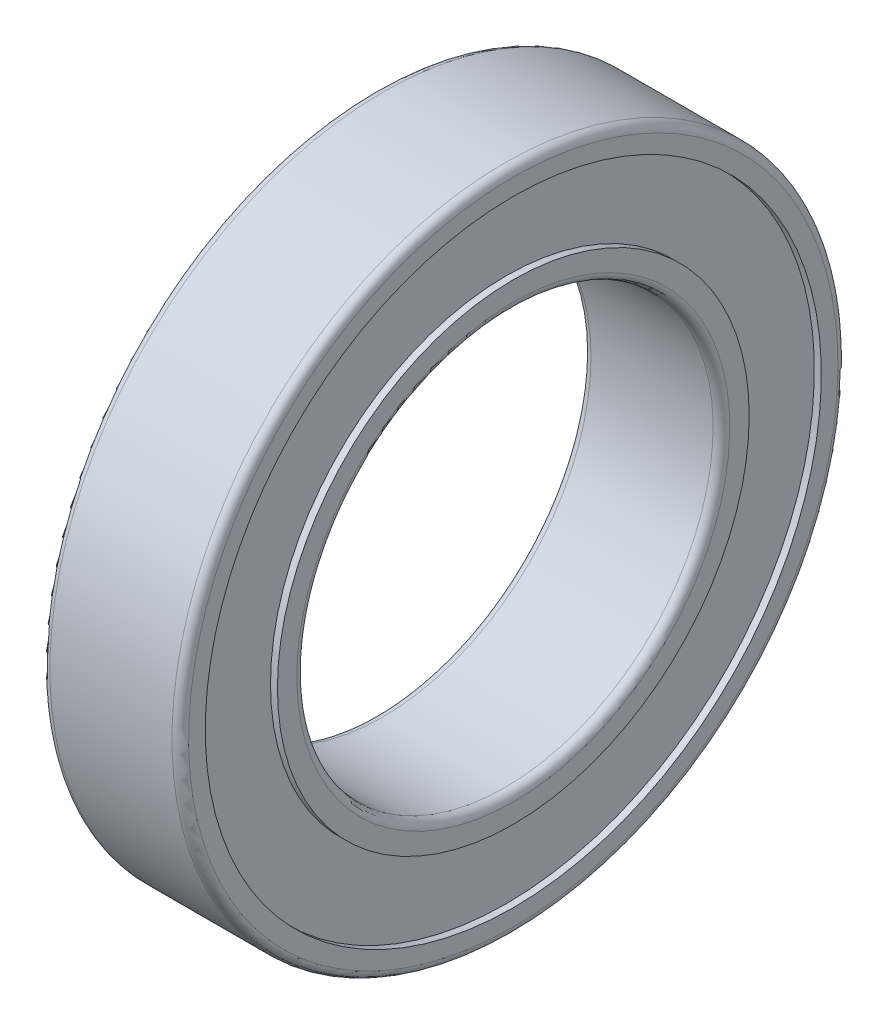
ISO-10303-21;
HEADER;
FILE_DESCRIPTION(('STEP AP214'),'2;1');
FILE_NAME('part.step','',(''),(''),'','','');
FILE_SCHEMA(('AUTOMOTIVE_DESIGN { 1 0 10303 214 1 1 1 1 }'));
ENDSEC;
DATA;
#1=APPLICATION_CONTEXT('core data for automotive mechanical design processes');
#2=APPLICATION_PROTOCOL_DEFINITION('international standard','automotive_design',2000,#1);
#3=PRODUCT_CONTEXT('',#1,'mechanical');
#4=PRODUCT('Part','Part','',(#3));
#5=PRODUCT_RELATED_PRODUCT_CATEGORY('part','',(#4));
#6=PRODUCT_DEFINITION_FORMATION('','',#4);
#7=PRODUCT_DEFINITION_CONTEXT('part definition',#1,'design');
#8=PRODUCT_DEFINITION('design','',#6,#7);
#9=PRODUCT_DEFINITION_SHAPE('','',#8);
#10=(LENGTH_UNIT() NAMED_UNIT(*) SI_UNIT(.MILLI.,.METRE.));
#11=(NAMED_UNIT(*) PLANE_ANGLE_UNIT() SI_UNIT($,.RADIAN.));
#12=(NAMED_UNIT(*) SI_UNIT($,.STERADIAN.) SOLID_ANGLE_UNIT());
#13=UNCERTAINTY_MEASURE_WITH_UNIT(LENGTH_MEASURE(1.E-05),#10,'distance_accuracy_value','');
#14=(GEOMETRIC_REPRESENTATION_CONTEXT(3) GLOBAL_UNCERTAINTY_ASSIGNED_CONTEXT((#13)) GLOBAL_UNIT_ASSIGNED_CONTEXT((#10,
#11,#12)) REPRESENTATION_CONTEXT('',''));
#15=CARTESIAN_POINT('',(0.,0.,0.));
#16=DIRECTION('',(0.,0.,1.));
#17=DIRECTION('',(1.,0.,0.));
#18=AXIS2_PLACEMENT_3D('',#15,#16,#17);
#19=CARTESIAN_POINT('',(0.,0.,0.));
#20=DIRECTION('',(-1.,0.,0.));
#21=DIRECTION('',(0.,-1.,0.));
#22=AXIS2_PLACEMENT_3D('',#19,#20,#21);
#23=CYLINDRICAL_SURFACE('',#22,7.5);
#24=CARTESIAN_POINT('',(0.3,0.,0.));
#25=DIRECTION('',(1.,0.,0.));
#26=DIRECTION('',(0.,1.,0.));
#27=AXIS2_PLACEMENT_3D('',#24,#25,#26);
#28=CIRCLE('',#27,7.5);
#29=CARTESIAN_POINT('',(0.3,7.5,0.));
#30=VERTEX_POINT('',#29);
#31=EDGE_CURVE('E57',#30,#30,#28,.F.);
#32=ORIENTED_EDGE('',*,*,#31,.T.);
#33=EDGE_LOOP('',(#32));
#34=FACE_BOUND('',#33,.T.);
#35=CARTESIAN_POINT('',(4.7,0.,0.));
#36=DIRECTION('',(-1.,0.,0.));
#37=DIRECTION('',(0.,-1.,0.));
#38=AXIS2_PLACEMENT_3D('',#35,#36,#37);
#39=CIRCLE('',#38,7.5);
#40=CARTESIAN_POINT('',(4.7,-7.5,0.));
#41=VERTEX_POINT('',#40);
#42=EDGE_CURVE('E60',#41,#41,#39,.F.);
#43=ORIENTED_EDGE('',*,*,#42,.T.);
#44=EDGE_LOOP('',(#43));
#45=FACE_BOUND('',#44,.T.);
#46=ADVANCED_FACE('F31',(#34,#45),#23,.F.);
#47=CARTESIAN_POINT('',(0.,7.5,0.));
#48=DIRECTION('',(1.,0.,0.));
#49=DIRECTION('',(0.,1.,0.));
#50=AXIS2_PLACEMENT_3D('',#47,#48,#49);
#51=PLANE('',#50);
#52=CARTESIAN_POINT('',(0.,0.,0.));
#53=DIRECTION('',(1.,0.,0.));
#54=DIRECTION('',(0.,1.,0.));
#55=AXIS2_PLACEMENT_3D('',#52,#53,#54);
#56=CIRCLE('',#55,7.8);
#57=CARTESIAN_POINT('',(0.,7.8,0.));
#58=VERTEX_POINT('',#57);
#59=EDGE_CURVE('E54',#58,#58,#56,.T.);
#60=ORIENTED_EDGE('',*,*,#59,.T.);
#61=EDGE_LOOP('',(#60));
#62=FACE_BOUND('',#61,.T.);
#63=CARTESIAN_POINT('',(0.,0.,0.));
#64=DIRECTION('',(-1.,0.,0.));
#65=DIRECTION('',(0.,-1.,0.));
#66=AXIS2_PLACEMENT_3D('',#63,#64,#65);
#67=CIRCLE('',#66,8.5);
#68=CARTESIAN_POINT('',(0.,-8.5,0.));
#69=VERTEX_POINT('',#68);
#70=EDGE_CURVE('E63',#69,#69,#67,.T.);
#71=ORIENTED_EDGE('',*,*,#70,.T.);
#72=EDGE_LOOP('',(#71));
#73=FACE_BOUND('',#72,.T.);
#74=ADVANCED_FACE('F106',(#62,#73),#51,.F.);
#75=CARTESIAN_POINT('',(0.,0.,0.));
#76=DIRECTION('',(-1.,0.,0.));
#77=DIRECTION('',(0.,-1.,0.));
#78=AXIS2_PLACEMENT_3D('',#75,#76,#77);
#79=CYLINDRICAL_SURFACE('',#78,8.5);
#80=ORIENTED_EDGE('',*,*,#70,.F.);
#81=EDGE_LOOP('',(#80));
#82=FACE_BOUND('',#81,.T.);
#83=CARTESIAN_POINT('',(0.25,0.,0.));
#84=DIRECTION('',(-1.,0.,0.));
#85=DIRECTION('',(0.,-1.,0.));
#86=AXIS2_PLACEMENT_3D('',#83,#84,#85);
#87=CIRCLE('',#86,8.5);
#88=CARTESIAN_POINT('',(0.25,-8.5,0.));
#89=VERTEX_POINT('',#88);
#90=EDGE_CURVE('E66',#89,#89,#87,.T.);
#91=ORIENTED_EDGE('',*,*,#90,.T.);
#92=EDGE_LOOP('',(#91));
#93=FACE_BOUND('',#92,.T.);
#94=ADVANCED_FACE('F112',(#82,#93),#79,.T.);
#95=CARTESIAN_POINT('',(0.25,8.5,0.));
#96=DIRECTION('',(1.,0.,0.));
#97=DIRECTION('',(0.,1.,0.));
#98=AXIS2_PLACEMENT_3D('',#95,#96,#97);
#99=PLANE('',#98);
#100=ORIENTED_EDGE('',*,*,#90,.F.);
#101=EDGE_LOOP('',(#100));
#102=FACE_BOUND('',#101,.T.);
#103=CARTESIAN_POINT('',(0.25,0.,0.));
#104=DIRECTION('',(-1.,0.,0.));
#105=DIRECTION('',(0.,-1.,0.));
#106=AXIS2_PLACEMENT_3D('',#103,#104,#105);
#107=CIRCLE('',#106,11.1);
#108=CARTESIAN_POINT('',(0.249999999999999,-11.1,0.));
#109=VERTEX_POINT('',#108);
#110=EDGE_CURVE('E69',#109,#109,#107,.T.);
#111=ORIENTED_EDGE('',*,*,#110,.T.);
#112=EDGE_LOOP('',(#111));
#113=FACE_BOUND('',#112,.T.);
#114=ADVANCED_FACE('F139',(#102,#113),#99,.F.);
#115=CARTESIAN_POINT('',(0.,0.,0.));
#116=DIRECTION('',(-1.,0.,0.));
#117=DIRECTION('',(0.,-1.,0.));
#118=AXIS2_PLACEMENT_3D('',#115,#116,#117);
#119=CYLINDRICAL_SURFACE('',#118,11.1);
#120=ORIENTED_EDGE('',*,*,#110,.F.);
#121=EDGE_LOOP('',(#120));
#122=FACE_BOUND('',#121,.T.);
#123=CARTESIAN_POINT('',(0.,0.,0.));
#124=DIRECTION('',(-1.,0.,0.));
#125=DIRECTION('',(0.,-1.,0.));
#126=AXIS2_PLACEMENT_3D('',#123,#124,#125);
#127=CIRCLE('',#126,11.1);
#128=CARTESIAN_POINT('',(0.,-11.1,0.));
#129=VERTEX_POINT('',#128);
#130=EDGE_CURVE('E72',#129,#129,#127,.T.);
#131=ORIENTED_EDGE('',*,*,#130,.T.);
#132=EDGE_LOOP('',(#131));
#133=FACE_BOUND('',#132,.T.);
#134=ADVANCED_FACE('F134',(#122,#133),#119,.F.);
#135=CARTESIAN_POINT('',(0.,11.1,0.));
#136=DIRECTION('',(1.,0.,0.));
#137=DIRECTION('',(0.,1.,0.));
#138=AXIS2_PLACEMENT_3D('',#135,#136,#137);
#139=PLANE('',#138);
#140=CARTESIAN_POINT('',(0.,0.,0.));
#141=DIRECTION('',(1.,0.,0.));
#142=DIRECTION('',(0.,1.,0.));
#143=AXIS2_PLACEMENT_3D('',#140,#141,#142);
#144=CIRCLE('',#143,11.7);
#145=CARTESIAN_POINT('',(0.,11.7,0.));
#146=VERTEX_POINT('',#145);
#147=EDGE_CURVE('E46',#146,#146,#144,.F.);
#148=ORIENTED_EDGE('',*,*,#147,.T.);
#149=EDGE_LOOP('',(#148));
#150=FACE_BOUND('',#149,.T.);
#151=ORIENTED_EDGE('',*,*,#130,.F.);
#152=EDGE_LOOP('',(#151));
#153=FACE_BOUND('',#152,.T.);
#154=ADVANCED_FACE('F130',(#150,#153),#139,.F.);
#155=CARTESIAN_POINT('',(0.,0.,0.));
#156=DIRECTION('',(-1.,0.,0.));
#157=DIRECTION('',(0.,-1.,0.));
#158=AXIS2_PLACEMENT_3D('',#155,#156,#157);
#159=CYLINDRICAL_SURFACE('',#158,12.);
#160=CARTESIAN_POINT('',(0.3,0.,0.));
#161=DIRECTION('',(1.,0.,0.));
#162=DIRECTION('',(0.,1.,0.));
#163=AXIS2_PLACEMENT_3D('',#160,#161,#162);
#164=CIRCLE('',#163,12.);
#165=CARTESIAN_POINT('',(0.3,12.,0.));
#166=VERTEX_POINT('',#165);
#167=EDGE_CURVE('E38',#166,#166,#164,.T.);
#168=ORIENTED_EDGE('',*,*,#167,.T.);
#169=EDGE_LOOP('',(#168));
#170=FACE_BOUND('',#169,.T.);
#171=CARTESIAN_POINT('',(4.7,0.,0.));
#172=DIRECTION('',(-1.,0.,0.));
#173=DIRECTION('',(0.,-1.,0.));
#174=AXIS2_PLACEMENT_3D('',#171,#172,#173);
#175=CIRCLE('',#174,12.);
#176=CARTESIAN_POINT('',(4.7,-12.,0.));
#177=VERTEX_POINT('',#176);
#178=EDGE_CURVE('E42',#177,#177,#175,.T.);
#179=ORIENTED_EDGE('',*,*,#178,.T.);
#180=EDGE_LOOP('',(#179));
#181=FACE_BOUND('',#180,.T.);
#182=ADVANCED_FACE('F133',(#170,#181),#159,.T.);
#183=CARTESIAN_POINT('',(5.,12.,0.));
#184=DIRECTION('',(-1.,0.,0.));
#185=DIRECTION('',(0.,-1.,0.));
#186=AXIS2_PLACEMENT_3D('',#183,#184,#185);
#187=PLANE('',#186);
#188=CARTESIAN_POINT('',(5.,0.,0.));
#189=DIRECTION('',(-1.,0.,0.));
#190=DIRECTION('',(0.,-1.,0.));
#191=AXIS2_PLACEMENT_3D('',#188,#189,#190);
#192=CIRCLE('',#191,11.7);
#193=CARTESIAN_POINT('',(5.,-11.7,0.));
#194=VERTEX_POINT('',#193);
#195=EDGE_CURVE('E10',#194,#194,#192,.F.);
#196=ORIENTED_EDGE('',*,*,#195,.T.);
#197=EDGE_LOOP('',(#196));
#198=FACE_BOUND('',#197,.T.);
#199=CARTESIAN_POINT('',(5.,0.,0.));
#200=DIRECTION('',(-1.,0.,0.));
#201=DIRECTION('',(0.,-1.,0.));
#202=AXIS2_PLACEMENT_3D('',#199,#200,#201);
#203=CIRCLE('',#202,11.1);
#204=CARTESIAN_POINT('',(5.,-11.1,0.));
#205=VERTEX_POINT('',#204);
#206=EDGE_CURVE('E75',#205,#205,#203,.T.);
#207=ORIENTED_EDGE('',*,*,#206,.T.);
#208=EDGE_LOOP('',(#207));
#209=FACE_BOUND('',#208,.T.);
#210=ADVANCED_FACE('F179',(#198,#209),#187,.F.);
#211=CARTESIAN_POINT('',(0.,0.,0.));
#212=DIRECTION('',(-1.,0.,0.));
#213=DIRECTION('',(0.,-1.,0.));
#214=AXIS2_PLACEMENT_3D('',#211,#212,#213);
#215=CYLINDRICAL_SURFACE('',#214,11.1);
#216=ORIENTED_EDGE('',*,*,#206,.F.);
#217=EDGE_LOOP('',(#216));
#218=FACE_BOUND('',#217,.T.);
#219=CARTESIAN_POINT('',(4.75,0.,0.));
#220=DIRECTION('',(-1.,0.,0.));
#221=DIRECTION('',(0.,-1.,0.));
#222=AXIS2_PLACEMENT_3D('',#219,#220,#221);
#223=CIRCLE('',#222,11.1);
#224=CARTESIAN_POINT('',(4.75,-11.1,0.));
#225=VERTEX_POINT('',#224);
#226=EDGE_CURVE('E78',#225,#225,#223,.T.);
#227=ORIENTED_EDGE('',*,*,#226,.T.);
#228=EDGE_LOOP('',(#227));
#229=FACE_BOUND('',#228,.T.);
#230=ADVANCED_FACE('F174',(#218,#229),#215,.F.);
#231=CARTESIAN_POINT('',(4.75,11.1,0.));
#232=DIRECTION('',(-1.,0.,0.));
#233=DIRECTION('',(0.,-1.,0.));
#234=AXIS2_PLACEMENT_3D('',#231,#232,#233);
#235=PLANE('',#234);
#236=ORIENTED_EDGE('',*,*,#226,.F.);
#237=EDGE_LOOP('',(#236));
#238=FACE_BOUND('',#237,.T.);
#239=CARTESIAN_POINT('',(4.75,0.,0.));
#240=DIRECTION('',(-1.,0.,0.));
#241=DIRECTION('',(0.,-1.,0.));
#242=AXIS2_PLACEMENT_3D('',#239,#240,#241);
#243=CIRCLE('',#242,8.5);
#244=CARTESIAN_POINT('',(4.75,-8.5,0.));
#245=VERTEX_POINT('',#244);
#246=EDGE_CURVE('E81',#245,#245,#243,.T.);
#247=ORIENTED_EDGE('',*,*,#246,.T.);
#248=EDGE_LOOP('',(#247));
#249=FACE_BOUND('',#248,.T.);
#250=ADVANCED_FACE('F102',(#238,#249),#235,.F.);
#251=CARTESIAN_POINT('',(0.,0.,0.));
#252=DIRECTION('',(-1.,0.,0.));
#253=DIRECTION('',(0.,-1.,0.));
#254=AXIS2_PLACEMENT_3D('',#251,#252,#253);
#255=CYLINDRICAL_SURFACE('',#254,8.5);
#256=ORIENTED_EDGE('',*,*,#246,.F.);
#257=EDGE_LOOP('',(#256));
#258=FACE_BOUND('',#257,.T.);
#259=CARTESIAN_POINT('',(5.,0.,0.));
#260=DIRECTION('',(-1.,0.,0.));
#261=DIRECTION('',(0.,-1.,0.));
#262=AXIS2_PLACEMENT_3D('',#259,#260,#261);
#263=CIRCLE('',#262,8.5);
#264=CARTESIAN_POINT('',(5.,-8.5,0.));
#265=VERTEX_POINT('',#264);
#266=EDGE_CURVE('E84',#265,#265,#263,.T.);
#267=ORIENTED_EDGE('',*,*,#266,.T.);
#268=EDGE_LOOP('',(#267));
#269=FACE_BOUND('',#268,.T.);
#270=ADVANCED_FACE('F88',(#258,#269),#255,.T.);
#271=CARTESIAN_POINT('',(5.,8.5,0.));
#272=DIRECTION('',(-1.,0.,0.));
#273=DIRECTION('',(0.,-1.,0.));
#274=AXIS2_PLACEMENT_3D('',#271,#272,#273);
#275=PLANE('',#274);
#276=CARTESIAN_POINT('',(5.,0.,0.));
#277=DIRECTION('',(-1.,0.,0.));
#278=DIRECTION('',(0.,-1.,0.));
#279=AXIS2_PLACEMENT_3D('',#276,#277,#278);
#280=CIRCLE('',#279,7.8);
#281=CARTESIAN_POINT('',(5.,-7.8,0.));
#282=VERTEX_POINT('',#281);
#283=EDGE_CURVE('E51',#282,#282,#280,.T.);
#284=ORIENTED_EDGE('',*,*,#283,.T.);
#285=EDGE_LOOP('',(#284));
#286=FACE_BOUND('',#285,.T.);
#287=ORIENTED_EDGE('',*,*,#266,.F.);
#288=EDGE_LOOP('',(#287));
#289=FACE_BOUND('',#288,.T.);
#290=ADVANCED_FACE('F90',(#286,#289),#275,.F.);
#291=CARTESIAN_POINT('',(0.3,0.,0.));
#292=DIRECTION('',(1.,0.,0.));
#293=DIRECTION('',(0.,1.,0.));
#294=AXIS2_PLACEMENT_3D('',#291,#292,#293);
#295=TOROIDAL_SURFACE('',#294,7.8,0.3);
#296=ORIENTED_EDGE('',*,*,#59,.F.);
#297=EDGE_LOOP('',(#296));
#298=FACE_BOUND('',#297,.T.);
#299=ORIENTED_EDGE('',*,*,#31,.F.);
#300=EDGE_LOOP('',(#299));
#301=FACE_BOUND('',#300,.T.);
#302=ADVANCED_FACE('F92',(#298,#301),#295,.T.);
#303=CARTESIAN_POINT('',(4.7,0.,0.));
#304=DIRECTION('',(-1.,0.,0.));
#305=DIRECTION('',(0.,-1.,0.));
#306=AXIS2_PLACEMENT_3D('',#303,#304,#305);
#307=TOROIDAL_SURFACE('',#306,7.8,0.3);
#308=ORIENTED_EDGE('',*,*,#42,.F.);
#309=EDGE_LOOP('',(#308));
#310=FACE_BOUND('',#309,.T.);
#311=ORIENTED_EDGE('',*,*,#283,.F.);
#312=EDGE_LOOP('',(#311));
#313=FACE_BOUND('',#312,.T.);
#314=ADVANCED_FACE('F99',(#310,#313),#307,.T.);
#315=CARTESIAN_POINT('',(0.3,0.,0.));
#316=DIRECTION('',(1.,0.,0.));
#317=DIRECTION('',(0.,1.,0.));
#318=AXIS2_PLACEMENT_3D('',#315,#316,#317);
#319=TOROIDAL_SURFACE('',#318,11.7,0.3);
#320=ORIENTED_EDGE('',*,*,#167,.F.);
#321=EDGE_LOOP('',(#320));
#322=FACE_BOUND('',#321,.T.);
#323=ORIENTED_EDGE('',*,*,#147,.F.);
#324=EDGE_LOOP('',(#323));
#325=FACE_BOUND('',#324,.T.);
#326=ADVANCED_FACE('F119',(#322,#325),#319,.T.);
#327=CARTESIAN_POINT('',(4.7,0.,0.));
#328=DIRECTION('',(-1.,0.,0.));
#329=DIRECTION('',(0.,-1.,0.));
#330=AXIS2_PLACEMENT_3D('',#327,#328,#329);
#331=TOROIDAL_SURFACE('',#330,11.7,0.3);
#332=ORIENTED_EDGE('',*,*,#195,.F.);
#333=EDGE_LOOP('',(#332));
#334=FACE_BOUND('',#333,.T.);
#335=ORIENTED_EDGE('',*,*,#178,.F.);
#336=EDGE_LOOP('',(#335));
#337=FACE_BOUND('',#336,.T.);
#338=ADVANCED_FACE('F33',(#334,#337),#331,.T.);
#339=CLOSED_SHELL('',(#46,#74,#94,#114,#134,#154,#182,#210,#230,#250,#270,#290,#302,#314,#326,#338));
#340=MANIFOLD_SOLID_BREP('B2',#339);
#341=ADVANCED_BREP_SHAPE_REPRESENTATION('',(#18,#340),#14);
#342=SHAPE_DEFINITION_REPRESENTATION(#9,#341);
ENDSEC;
END-ISO-10303-21;
